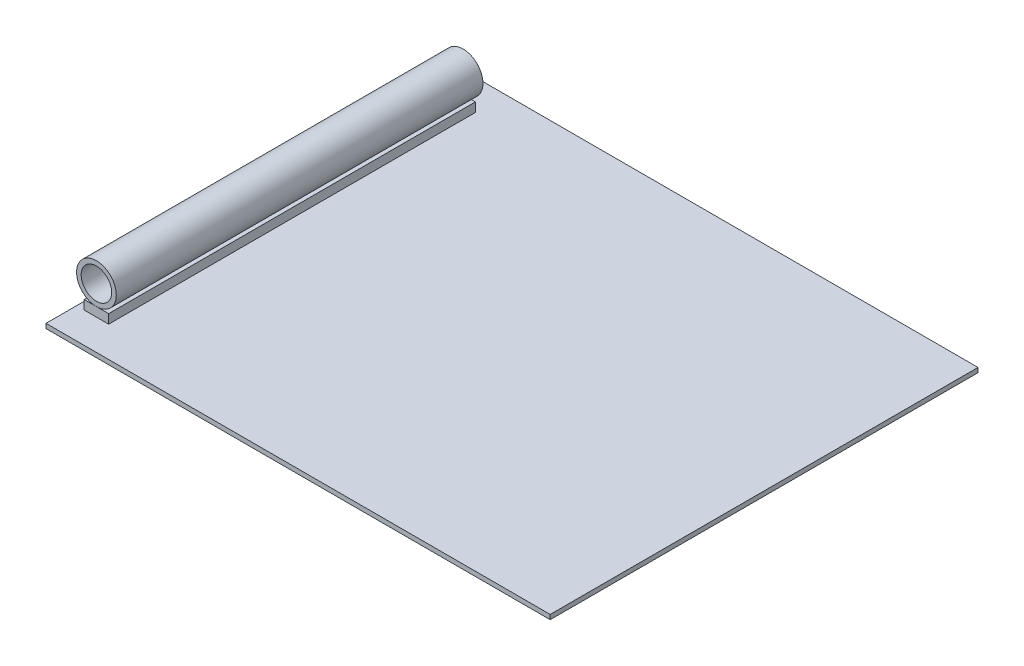
ISO-10303-21;
HEADER;
FILE_DESCRIPTION(('STEP AP214'),'2;1');
FILE_NAME('part.step','',(''),(''),'','','');
FILE_SCHEMA(('AUTOMOTIVE_DESIGN { 1 0 10303 214 1 1 1 1 }'));
ENDSEC;
DATA;
#1=APPLICATION_CONTEXT('core data for automotive mechanical design processes');
#2=APPLICATION_PROTOCOL_DEFINITION('international standard','automotive_design',2000,#1);
#3=PRODUCT_CONTEXT('',#1,'mechanical');
#4=PRODUCT('Part','Part','',(#3));
#5=PRODUCT_RELATED_PRODUCT_CATEGORY('part','',(#4));
#6=PRODUCT_DEFINITION_FORMATION('','',#4);
#7=PRODUCT_DEFINITION_CONTEXT('part definition',#1,'design');
#8=PRODUCT_DEFINITION('design','',#6,#7);
#9=PRODUCT_DEFINITION_SHAPE('','',#8);
#10=(LENGTH_UNIT() NAMED_UNIT(*) SI_UNIT(.MILLI.,.METRE.));
#11=(NAMED_UNIT(*) PLANE_ANGLE_UNIT() SI_UNIT($,.RADIAN.));
#12=(NAMED_UNIT(*) SI_UNIT($,.STERADIAN.) SOLID_ANGLE_UNIT());
#13=UNCERTAINTY_MEASURE_WITH_UNIT(LENGTH_MEASURE(1.E-05),#10,'distance_accuracy_value','');
#14=(GEOMETRIC_REPRESENTATION_CONTEXT(3) GLOBAL_UNCERTAINTY_ASSIGNED_CONTEXT((#13)) GLOBAL_UNIT_ASSIGNED_CONTEXT((#10,
#11,#12)) REPRESENTATION_CONTEXT('',''));
#15=CARTESIAN_POINT('',(0.,0.,0.));
#16=DIRECTION('',(0.,0.,1.));
#17=DIRECTION('',(1.,0.,0.));
#18=AXIS2_PLACEMENT_3D('',#15,#16,#17);
#19=CARTESIAN_POINT('',(0.,4.5,-70.));
#20=DIRECTION('',(0.,-1.,0.));
#21=DIRECTION('',(0.,0.,-1.));
#22=AXIS2_PLACEMENT_3D('',#19,#20,#21);
#23=PLANE('',#22);
#24=DIRECTION('',(1.,0.,0.));
#25=VECTOR('',#24,1.);
#26=CARTESIAN_POINT('',(0.,4.5,-60.));
#27=LINE('',#26,#25);
#28=CARTESIAN_POINT('',(2.5,4.5,-60.));
#29=VERTEX_POINT('',#28);
#30=CARTESIAN_POINT('',(10.5,4.5,-60.));
#31=VERTEX_POINT('',#30);
#32=EDGE_CURVE('E149',#29,#31,#27,.T.);
#33=ORIENTED_EDGE('',*,*,#32,.F.);
#34=DIRECTION('',(0.,0.,1.));
#35=VECTOR('',#34,1.);
#36=CARTESIAN_POINT('',(2.5,4.5,-70.));
#37=LINE('',#36,#35);
#38=CARTESIAN_POINT('',(2.5,4.5,60.));
#39=VERTEX_POINT('',#38);
#40=EDGE_CURVE('E143',#29,#39,#37,.T.);
#41=ORIENTED_EDGE('',*,*,#40,.T.);
#42=DIRECTION('',(-1.,0.,0.));
#43=VECTOR('',#42,1.);
#44=CARTESIAN_POINT('',(0.,4.5,60.));
#45=LINE('',#44,#43);
#46=CARTESIAN_POINT('',(10.5,4.5,60.));
#47=VERTEX_POINT('',#46);
#48=EDGE_CURVE('E120',#47,#39,#45,.T.);
#49=ORIENTED_EDGE('',*,*,#48,.F.);
#50=DIRECTION('',(0.,0.,1.));
#51=VECTOR('',#50,1.);
#52=CARTESIAN_POINT('',(10.5,4.5,-70.));
#53=LINE('',#52,#51);
#54=EDGE_CURVE('E147',#31,#47,#53,.T.);
#55=ORIENTED_EDGE('',*,*,#54,.F.);
#56=EDGE_LOOP('',(#33,#41,#49,#55));
#57=FACE_BOUND('',#56,.T.);
#58=ADVANCED_FACE('F51',(#57),#23,.F.);
#59=CARTESIAN_POINT('',(2.5,0.,-70.));
#60=DIRECTION('',(1.,0.,0.));
#61=DIRECTION('',(0.,1.,0.));
#62=AXIS2_PLACEMENT_3D('',#59,#60,#61);
#63=PLANE('',#62);
#64=DIRECTION('',(0.,1.,0.));
#65=VECTOR('',#64,1.);
#66=CARTESIAN_POINT('',(2.5,0.,-60.));
#67=LINE('',#66,#65);
#68=CARTESIAN_POINT('',(2.5,1.5,-60.));
#69=VERTEX_POINT('',#68);
#70=EDGE_CURVE('E141',#69,#29,#67,.T.);
#71=ORIENTED_EDGE('',*,*,#70,.F.);
#72=DIRECTION('',(0.,0.,1.));
#73=VECTOR('',#72,1.);
#74=CARTESIAN_POINT('',(2.5,1.5,-70.));
#75=LINE('',#74,#73);
#76=CARTESIAN_POINT('',(2.5,1.5,60.));
#77=VERTEX_POINT('',#76);
#78=EDGE_CURVE('E133',#69,#77,#75,.T.);
#79=ORIENTED_EDGE('',*,*,#78,.T.);
#80=DIRECTION('',(0.,-1.,0.));
#81=VECTOR('',#80,1.);
#82=CARTESIAN_POINT('',(2.5,0.,60.));
#83=LINE('',#82,#81);
#84=EDGE_CURVE('E114',#39,#77,#83,.T.);
#85=ORIENTED_EDGE('',*,*,#84,.F.);
#86=ORIENTED_EDGE('',*,*,#40,.F.);
#87=EDGE_LOOP('',(#71,#79,#85,#86));
#88=FACE_BOUND('',#87,.T.);
#89=ADVANCED_FACE('F140',(#88),#63,.F.);
#90=CARTESIAN_POINT('',(10.5,0.,-70.));
#91=DIRECTION('',(1.,0.,0.));
#92=DIRECTION('',(0.,0.,-1.));
#93=AXIS2_PLACEMENT_3D('',#90,#91,#92);
#94=PLANE('',#93);
#95=DIRECTION('',(0.,0.,1.));
#96=VECTOR('',#95,1.);
#97=CARTESIAN_POINT('',(10.5,1.5,-70.));
#98=LINE('',#97,#96);
#99=CARTESIAN_POINT('',(10.5,1.5,-60.));
#100=VERTEX_POINT('',#99);
#101=CARTESIAN_POINT('',(10.5,1.5,60.));
#102=VERTEX_POINT('',#101);
#103=EDGE_CURVE('E135',#100,#102,#98,.T.);
#104=ORIENTED_EDGE('',*,*,#103,.F.);
#105=DIRECTION('',(0.,1.,0.));
#106=VECTOR('',#105,1.);
#107=CARTESIAN_POINT('',(10.5,0.,-60.));
#108=LINE('',#107,#106);
#109=EDGE_CURVE('E126',#100,#31,#108,.T.);
#110=ORIENTED_EDGE('',*,*,#109,.T.);
#111=ORIENTED_EDGE('',*,*,#54,.T.);
#112=DIRECTION('',(0.,-1.,0.));
#113=VECTOR('',#112,1.);
#114=CARTESIAN_POINT('',(10.5,0.,60.));
#115=LINE('',#114,#113);
#116=EDGE_CURVE('E201',#47,#102,#115,.T.);
#117=ORIENTED_EDGE('',*,*,#116,.T.);
#118=EDGE_LOOP('',(#104,#110,#111,#117));
#119=FACE_BOUND('',#118,.T.);
#120=ADVANCED_FACE('F206',(#119),#94,.T.);
#121=CARTESIAN_POINT('',(0.,0.,-70.));
#122=DIRECTION('',(0.,0.,1.));
#123=DIRECTION('',(1.,0.,0.));
#124=AXIS2_PLACEMENT_3D('',#121,#122,#123);
#125=PLANE('',#124);
#126=DIRECTION('',(0.,1.,0.));
#127=VECTOR('',#126,1.);
#128=CARTESIAN_POINT('',(0.,0.,-70.));
#129=LINE('',#128,#127);
#130=CARTESIAN_POINT('',(0.,0.,-70.));
#131=VERTEX_POINT('',#130);
#132=CARTESIAN_POINT('',(0.,1.5,-70.));
#133=VERTEX_POINT('',#132);
#134=EDGE_CURVE('E12',#131,#133,#129,.T.);
#135=ORIENTED_EDGE('',*,*,#134,.T.);
#136=DIRECTION('',(1.,0.,0.));
#137=VECTOR('',#136,1.);
#138=CARTESIAN_POINT('',(0.,1.5,-70.));
#139=LINE('',#138,#137);
#140=CARTESIAN_POINT('',(165.,1.5,-70.));
#141=VERTEX_POINT('',#140);
#142=EDGE_CURVE('E60',#133,#141,#139,.T.);
#143=ORIENTED_EDGE('',*,*,#142,.T.);
#144=DIRECTION('',(0.,1.,0.));
#145=VECTOR('',#144,1.);
#146=CARTESIAN_POINT('',(165.,0.,-70.));
#147=LINE('',#146,#145);
#148=CARTESIAN_POINT('',(165.,0.,-70.));
#149=VERTEX_POINT('',#148);
#150=EDGE_CURVE('E183',#149,#141,#147,.T.);
#151=ORIENTED_EDGE('',*,*,#150,.F.);
#152=DIRECTION('',(1.,0.,0.));
#153=VECTOR('',#152,1.);
#154=CARTESIAN_POINT('',(0.,0.,-70.));
#155=LINE('',#154,#153);
#156=EDGE_CURVE('E179',#131,#149,#155,.T.);
#157=ORIENTED_EDGE('',*,*,#156,.F.);
#158=EDGE_LOOP('',(#135,#143,#151,#157));
#159=FACE_BOUND('',#158,.T.);
#160=ADVANCED_FACE('F225',(#159),#125,.F.);
#161=CARTESIAN_POINT('',(0.,0.,70.));
#162=DIRECTION('',(0.,0.,1.));
#163=DIRECTION('',(1.,0.,0.));
#164=AXIS2_PLACEMENT_3D('',#161,#162,#163);
#165=PLANE('',#164);
#166=DIRECTION('',(1.,0.,0.));
#167=VECTOR('',#166,1.);
#168=CARTESIAN_POINT('',(0.,1.5,70.));
#169=LINE('',#168,#167);
#170=CARTESIAN_POINT('',(0.,1.5,70.));
#171=VERTEX_POINT('',#170);
#172=CARTESIAN_POINT('',(165.,1.5,70.));
#173=VERTEX_POINT('',#172);
#174=EDGE_CURVE('E172',#171,#173,#169,.T.);
#175=ORIENTED_EDGE('',*,*,#174,.F.);
#176=DIRECTION('',(0.,1.,0.));
#177=VECTOR('',#176,1.);
#178=CARTESIAN_POINT('',(0.,0.,70.));
#179=LINE('',#178,#177);
#180=CARTESIAN_POINT('',(0.,0.,70.));
#181=VERTEX_POINT('',#180);
#182=EDGE_CURVE('E175',#181,#171,#179,.T.);
#183=ORIENTED_EDGE('',*,*,#182,.F.);
#184=DIRECTION('',(1.,0.,0.));
#185=VECTOR('',#184,1.);
#186=CARTESIAN_POINT('',(0.,0.,70.));
#187=LINE('',#186,#185);
#188=CARTESIAN_POINT('',(165.,0.,70.));
#189=VERTEX_POINT('',#188);
#190=EDGE_CURVE('E156',#181,#189,#187,.T.);
#191=ORIENTED_EDGE('',*,*,#190,.T.);
#192=DIRECTION('',(0.,1.,0.));
#193=VECTOR('',#192,1.);
#194=CARTESIAN_POINT('',(165.,0.,70.));
#195=LINE('',#194,#193);
#196=EDGE_CURVE('E168',#189,#173,#195,.T.);
#197=ORIENTED_EDGE('',*,*,#196,.T.);
#198=EDGE_LOOP('',(#175,#183,#191,#197));
#199=FACE_BOUND('',#198,.T.);
#200=ADVANCED_FACE('F228',(#199),#165,.T.);
#201=CARTESIAN_POINT('',(0.,1.5,70.));
#202=DIRECTION('',(0.,1.,0.));
#203=DIRECTION('',(0.,0.,1.));
#204=AXIS2_PLACEMENT_3D('',#201,#202,#203);
#205=PLANE('',#204);
#206=ORIENTED_EDGE('',*,*,#78,.F.);
#207=DIRECTION('',(1.,0.,0.));
#208=VECTOR('',#207,1.);
#209=CARTESIAN_POINT('',(-7.5,1.5,-60.));
#210=LINE('',#209,#208);
#211=EDGE_CURVE('E137',#69,#100,#210,.T.);
#212=ORIENTED_EDGE('',*,*,#211,.T.);
#213=ORIENTED_EDGE('',*,*,#103,.T.);
#214=DIRECTION('',(1.,0.,0.));
#215=VECTOR('',#214,1.);
#216=CARTESIAN_POINT('',(-7.5,1.5,60.));
#217=LINE('',#216,#215);
#218=EDGE_CURVE('E117',#77,#102,#217,.T.);
#219=ORIENTED_EDGE('',*,*,#218,.F.);
#220=EDGE_LOOP('',(#206,#212,#213,#219));
#221=FACE_BOUND('',#220,.T.);
#222=DIRECTION('',(0.,0.,-1.));
#223=VECTOR('',#222,1.);
#224=CARTESIAN_POINT('',(0.,1.5,70.));
#225=LINE('',#224,#223);
#226=EDGE_CURVE('E153',#171,#133,#225,.T.);
#227=ORIENTED_EDGE('',*,*,#226,.F.);
#228=ORIENTED_EDGE('',*,*,#174,.T.);
#229=DIRECTION('',(0.,0.,-1.));
#230=VECTOR('',#229,1.);
#231=CARTESIAN_POINT('',(165.,1.5,70.));
#232=LINE('',#231,#230);
#233=EDGE_CURVE('E157',#173,#141,#232,.T.);
#234=ORIENTED_EDGE('',*,*,#233,.T.);
#235=ORIENTED_EDGE('',*,*,#142,.F.);
#236=EDGE_LOOP('',(#227,#228,#234,#235));
#237=FACE_BOUND('',#236,.T.);
#238=ADVANCED_FACE('F131',(#221,#237),#205,.T.);
#239=CARTESIAN_POINT('',(0.,0.,70.));
#240=DIRECTION('',(-1.,0.,0.));
#241=DIRECTION('',(0.,0.,1.));
#242=AXIS2_PLACEMENT_3D('',#239,#240,#241);
#243=PLANE('',#242);
#244=ORIENTED_EDGE('',*,*,#226,.T.);
#245=ORIENTED_EDGE('',*,*,#134,.F.);
#246=DIRECTION('',(0.,0.,-1.));
#247=VECTOR('',#246,1.);
#248=CARTESIAN_POINT('',(0.,0.,70.));
#249=LINE('',#248,#247);
#250=EDGE_CURVE('E163',#181,#131,#249,.T.);
#251=ORIENTED_EDGE('',*,*,#250,.F.);
#252=ORIENTED_EDGE('',*,*,#182,.T.);
#253=EDGE_LOOP('',(#244,#245,#251,#252));
#254=FACE_BOUND('',#253,.T.);
#255=ADVANCED_FACE('F232',(#254),#243,.T.);
#256=CARTESIAN_POINT('',(0.,0.,70.));
#257=DIRECTION('',(0.,1.,0.));
#258=DIRECTION('',(0.,0.,1.));
#259=AXIS2_PLACEMENT_3D('',#256,#257,#258);
#260=PLANE('',#259);
#261=ORIENTED_EDGE('',*,*,#250,.T.);
#262=ORIENTED_EDGE('',*,*,#156,.T.);
#263=DIRECTION('',(0.,0.,-1.));
#264=VECTOR('',#263,1.);
#265=CARTESIAN_POINT('',(165.,0.,70.));
#266=LINE('',#265,#264);
#267=EDGE_CURVE('E160',#189,#149,#266,.T.);
#268=ORIENTED_EDGE('',*,*,#267,.F.);
#269=ORIENTED_EDGE('',*,*,#190,.F.);
#270=EDGE_LOOP('',(#261,#262,#268,#269));
#271=FACE_BOUND('',#270,.T.);
#272=ADVANCED_FACE('F53',(#271),#260,.F.);
#273=CARTESIAN_POINT('',(165.,0.,70.));
#274=DIRECTION('',(-1.,0.,0.));
#275=DIRECTION('',(0.,0.,1.));
#276=AXIS2_PLACEMENT_3D('',#273,#274,#275);
#277=PLANE('',#276);
#278=ORIENTED_EDGE('',*,*,#267,.T.);
#279=ORIENTED_EDGE('',*,*,#150,.T.);
#280=ORIENTED_EDGE('',*,*,#233,.F.);
#281=ORIENTED_EDGE('',*,*,#196,.F.);
#282=EDGE_LOOP('',(#278,#279,#280,#281));
#283=FACE_BOUND('',#282,.T.);
#284=ADVANCED_FACE('F215',(#283),#277,.F.);
#285=CARTESIAN_POINT('',(-7.5,1.5,60.));
#286=DIRECTION('',(0.,0.,1.));
#287=DIRECTION('',(1.,0.,0.));
#288=AXIS2_PLACEMENT_3D('',#285,#286,#287);
#289=PLANE('',#288);
#290=ORIENTED_EDGE('',*,*,#84,.T.);
#291=ORIENTED_EDGE('',*,*,#218,.T.);
#292=ORIENTED_EDGE('',*,*,#116,.F.);
#293=ORIENTED_EDGE('',*,*,#48,.T.);
#294=EDGE_LOOP('',(#290,#291,#292,#293));
#295=FACE_BOUND('',#294,.T.);
#296=ADVANCED_FACE('F116',(#295),#289,.T.);
#297=CARTESIAN_POINT('',(-7.5,1.5,-60.));
#298=DIRECTION('',(0.,0.,-1.));
#299=DIRECTION('',(-1.,0.,0.));
#300=AXIS2_PLACEMENT_3D('',#297,#298,#299);
#301=PLANE('',#300);
#302=ORIENTED_EDGE('',*,*,#70,.T.);
#303=ORIENTED_EDGE('',*,*,#32,.T.);
#304=ORIENTED_EDGE('',*,*,#109,.F.);
#305=ORIENTED_EDGE('',*,*,#211,.F.);
#306=EDGE_LOOP('',(#302,#303,#304,#305));
#307=FACE_BOUND('',#306,.T.);
#308=ADVANCED_FACE('F209',(#307),#301,.T.);
#309=CLOSED_SHELL('',(#58,#89,#120,#160,#200,#238,#255,#272,#284,#296,#308));
#310=MANIFOLD_SOLID_BREP('B2',#309);
#311=CARTESIAN_POINT('',(6.5,11.,-70.));
#312=DIRECTION('',(0.,0.,1.));
#313=DIRECTION('',(1.,0.,0.));
#314=AXIS2_PLACEMENT_3D('',#311,#312,#313);
#315=CYLINDRICAL_SURFACE('',#314,6.5);
#316=CARTESIAN_POINT('',(6.5,11.,60.));
#317=DIRECTION('',(0.,0.,1.));
#318=DIRECTION('',(1.,0.,0.));
#319=AXIS2_PLACEMENT_3D('',#316,#317,#318);
#320=CIRCLE('',#319,6.5);
#321=CARTESIAN_POINT('',(13.,11.,60.));
#322=VERTEX_POINT('',#321);
#323=EDGE_CURVE('E365',#322,#322,#320,.F.);
#324=ORIENTED_EDGE('',*,*,#323,.T.);
#325=EDGE_LOOP('',(#324));
#326=FACE_BOUND('',#325,.T.);
#327=CARTESIAN_POINT('',(6.5,11.,-60.));
#328=DIRECTION('',(0.,0.,-1.));
#329=DIRECTION('',(-1.,0.,0.));
#330=AXIS2_PLACEMENT_3D('',#327,#328,#329);
#331=CIRCLE('',#330,6.5);
#332=CARTESIAN_POINT('',(0.,11.,-60.));
#333=VERTEX_POINT('',#332);
#334=EDGE_CURVE('E355',#333,#333,#331,.F.);
#335=ORIENTED_EDGE('',*,*,#334,.T.);
#336=EDGE_LOOP('',(#335));
#337=FACE_BOUND('',#336,.T.);
#338=ADVANCED_FACE('F351',(#326,#337),#315,.T.);
#339=CARTESIAN_POINT('',(-7.5,1.5,60.));
#340=DIRECTION('',(0.,0.,1.));
#341=DIRECTION('',(1.,0.,0.));
#342=AXIS2_PLACEMENT_3D('',#339,#340,#341);
#343=PLANE('',#342);
#344=ORIENTED_EDGE('',*,*,#323,.F.);
#345=EDGE_LOOP('',(#344));
#346=FACE_BOUND('',#345,.T.);
#347=CARTESIAN_POINT('',(6.5,11.,60.));
#348=DIRECTION('',(0.,0.,1.));
#349=DIRECTION('',(1.,0.,0.));
#350=AXIS2_PLACEMENT_3D('',#347,#348,#349);
#351=CIRCLE('',#350,5.);
#352=CARTESIAN_POINT('',(11.5,11.,60.));
#353=VERTEX_POINT('',#352);
#354=EDGE_CURVE('E363',#353,#353,#351,.F.);
#355=ORIENTED_EDGE('',*,*,#354,.T.);
#356=EDGE_LOOP('',(#355));
#357=FACE_BOUND('',#356,.T.);
#358=ADVANCED_FACE('F372',(#346,#357),#343,.T.);
#359=CARTESIAN_POINT('',(-7.5,1.5,-60.));
#360=DIRECTION('',(0.,0.,-1.));
#361=DIRECTION('',(-1.,0.,0.));
#362=AXIS2_PLACEMENT_3D('',#359,#360,#361);
#363=PLANE('',#362);
#364=ORIENTED_EDGE('',*,*,#334,.F.);
#365=EDGE_LOOP('',(#364));
#366=FACE_BOUND('',#365,.T.);
#367=CARTESIAN_POINT('',(6.5,11.,-60.));
#368=DIRECTION('',(0.,0.,-1.));
#369=DIRECTION('',(-1.,0.,0.));
#370=AXIS2_PLACEMENT_3D('',#367,#368,#369);
#371=CIRCLE('',#370,5.);
#372=CARTESIAN_POINT('',(1.5,11.,-60.));
#373=VERTEX_POINT('',#372);
#374=EDGE_CURVE('E50',#373,#373,#371,.F.);
#375=ORIENTED_EDGE('',*,*,#374,.T.);
#376=EDGE_LOOP('',(#375));
#377=FACE_BOUND('',#376,.T.);
#378=ADVANCED_FACE('F376',(#366,#377),#363,.T.);
#379=CARTESIAN_POINT('',(6.5,11.,-70.));
#380=DIRECTION('',(0.,0.,1.));
#381=DIRECTION('',(1.,0.,0.));
#382=AXIS2_PLACEMENT_3D('',#379,#380,#381);
#383=CYLINDRICAL_SURFACE('',#382,5.);
#384=ORIENTED_EDGE('',*,*,#354,.F.);
#385=EDGE_LOOP('',(#384));
#386=FACE_BOUND('',#385,.T.);
#387=ORIENTED_EDGE('',*,*,#374,.F.);
#388=EDGE_LOOP('',(#387));
#389=FACE_BOUND('',#388,.T.);
#390=ADVANCED_FACE('F353',(#386,#389),#383,.F.);
#391=CLOSED_SHELL('',(#338,#358,#378,#390));
#392=MANIFOLD_SOLID_BREP('B6',#391);
#393=ADVANCED_BREP_SHAPE_REPRESENTATION('',(#18,#310,#392),#14);
#394=SHAPE_DEFINITION_REPRESENTATION(#9,#393);
ENDSEC;
END-ISO-10303-21;
